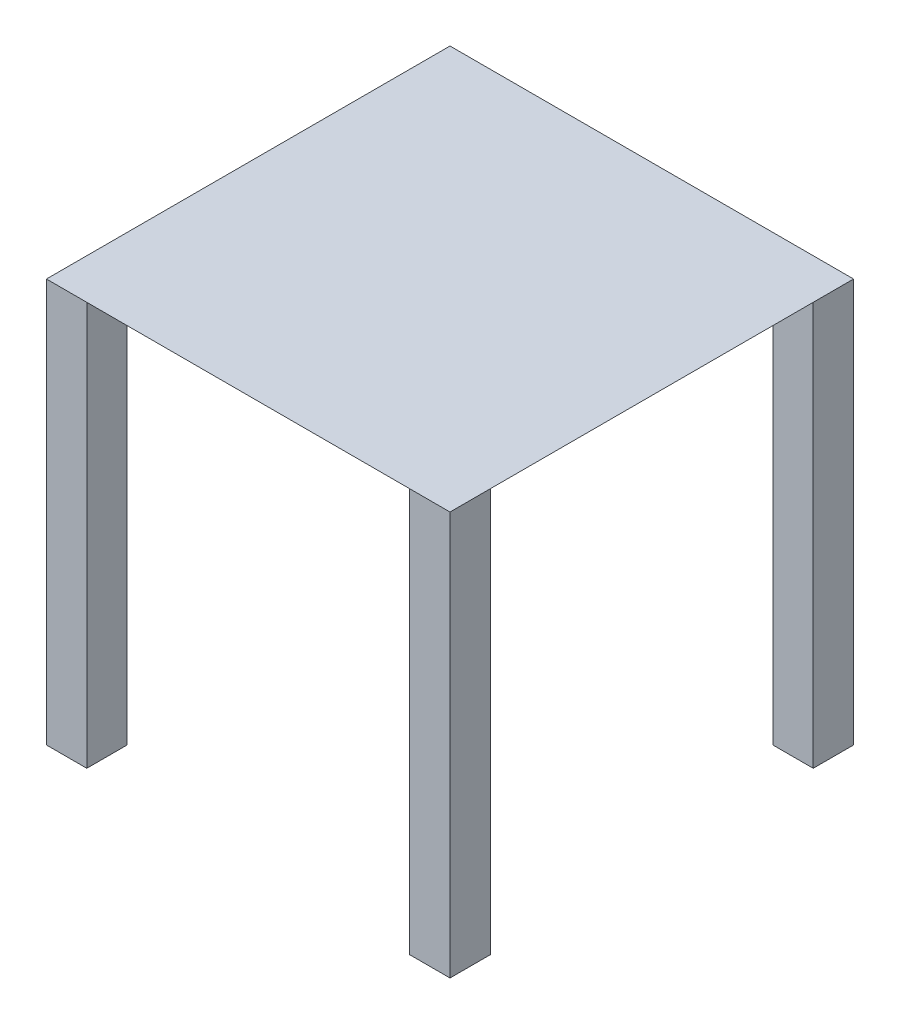
ISO-10303-21;
HEADER;
FILE_DESCRIPTION(('STEP AP214'),'2;1');
FILE_NAME('part.step','',(''),(''),'','','');
FILE_SCHEMA(('AUTOMOTIVE_DESIGN { 1 0 10303 214 1 1 1 1 }'));
ENDSEC;
DATA;
#1=APPLICATION_CONTEXT('core data for automotive mechanical design processes');
#2=APPLICATION_PROTOCOL_DEFINITION('international standard','automotive_design',2000,#1);
#3=PRODUCT_CONTEXT('',#1,'mechanical');
#4=PRODUCT('Part','Part','',(#3));
#5=PRODUCT_RELATED_PRODUCT_CATEGORY('part','',(#4));
#6=PRODUCT_DEFINITION_FORMATION('','',#4);
#7=PRODUCT_DEFINITION_CONTEXT('part definition',#1,'design');
#8=PRODUCT_DEFINITION('design','',#6,#7);
#9=PRODUCT_DEFINITION_SHAPE('','',#8);
#10=(LENGTH_UNIT() NAMED_UNIT(*) SI_UNIT(.MILLI.,.METRE.));
#11=(NAMED_UNIT(*) PLANE_ANGLE_UNIT() SI_UNIT($,.RADIAN.));
#12=(NAMED_UNIT(*) SI_UNIT($,.STERADIAN.) SOLID_ANGLE_UNIT());
#13=UNCERTAINTY_MEASURE_WITH_UNIT(LENGTH_MEASURE(1.E-05),#10,'distance_accuracy_value','');
#14=(GEOMETRIC_REPRESENTATION_CONTEXT(3) GLOBAL_UNCERTAINTY_ASSIGNED_CONTEXT((#13)) GLOBAL_UNIT_ASSIGNED_CONTEXT((#10,
#11,#12)) REPRESENTATION_CONTEXT('',''));
#15=CARTESIAN_POINT('',(0.,0.,0.));
#16=DIRECTION('',(0.,0.,1.));
#17=DIRECTION('',(1.,0.,0.));
#18=AXIS2_PLACEMENT_3D('',#15,#16,#17);
#19=CARTESIAN_POINT('',(0.,0.,0.));
#20=DIRECTION('',(0.,-1.,0.));
#21=DIRECTION('',(0.,0.,-1.));
#22=AXIS2_PLACEMENT_3D('',#19,#20,#21);
#23=PLANE('',#22);
#24=DIRECTION('',(1.,0.,0.));
#25=VECTOR('',#24,1.);
#26=CARTESIAN_POINT('',(-500.,0.,500.));
#27=LINE('',#26,#25);
#28=CARTESIAN_POINT('',(-400.,0.,500.));
#29=VERTEX_POINT('',#28);
#30=CARTESIAN_POINT('',(400.,0.,500.));
#31=VERTEX_POINT('',#30);
#32=EDGE_CURVE('E45',#29,#31,#27,.T.);
#33=ORIENTED_EDGE('',*,*,#32,.T.);
#34=DIRECTION('',(1.,0.,0.));
#35=VECTOR('',#34,1.);
#36=CARTESIAN_POINT('',(500.,0.,500.));
#37=LINE('',#36,#35);
#38=CARTESIAN_POINT('',(500.,0.,500.));
#39=VERTEX_POINT('',#38);
#40=EDGE_CURVE('E202',#31,#39,#37,.T.);
#41=ORIENTED_EDGE('',*,*,#40,.T.);
#42=DIRECTION('',(0.,0.,-1.));
#43=VECTOR('',#42,1.);
#44=CARTESIAN_POINT('',(500.,0.,500.));
#45=LINE('',#44,#43);
#46=CARTESIAN_POINT('',(500.,0.,400.));
#47=VERTEX_POINT('',#46);
#48=EDGE_CURVE('E226',#39,#47,#45,.T.);
#49=ORIENTED_EDGE('',*,*,#48,.T.);
#50=CARTESIAN_POINT('',(500.,0.,-400.));
#51=VERTEX_POINT('',#50);
#52=EDGE_CURVE('E231',#47,#51,#45,.T.);
#53=ORIENTED_EDGE('',*,*,#52,.T.);
#54=DIRECTION('',(0.,0.,-1.));
#55=VECTOR('',#54,1.);
#56=CARTESIAN_POINT('',(500.,0.,-500.));
#57=LINE('',#56,#55);
#58=CARTESIAN_POINT('',(500.,0.,-500.));
#59=VERTEX_POINT('',#58);
#60=EDGE_CURVE('E350',#51,#59,#57,.T.);
#61=ORIENTED_EDGE('',*,*,#60,.T.);
#62=DIRECTION('',(-1.,0.,0.));
#63=VECTOR('',#62,1.);
#64=CARTESIAN_POINT('',(-500.,0.,-500.));
#65=LINE('',#64,#63);
#66=CARTESIAN_POINT('',(400.,0.,-500.));
#67=VERTEX_POINT('',#66);
#68=EDGE_CURVE('E466',#59,#67,#65,.T.);
#69=ORIENTED_EDGE('',*,*,#68,.T.);
#70=CARTESIAN_POINT('',(-400.,0.,-500.));
#71=VERTEX_POINT('',#70);
#72=EDGE_CURVE('E230',#67,#71,#65,.T.);
#73=ORIENTED_EDGE('',*,*,#72,.T.);
#74=DIRECTION('',(-1.,0.,0.));
#75=VECTOR('',#74,1.);
#76=CARTESIAN_POINT('',(-500.,0.,-500.));
#77=LINE('',#76,#75);
#78=CARTESIAN_POINT('',(-500.,0.,-500.));
#79=VERTEX_POINT('',#78);
#80=EDGE_CURVE('E378',#71,#79,#77,.T.);
#81=ORIENTED_EDGE('',*,*,#80,.T.);
#82=DIRECTION('',(0.,0.,1.));
#83=VECTOR('',#82,1.);
#84=CARTESIAN_POINT('',(-500.,0.,500.));
#85=LINE('',#84,#83);
#86=CARTESIAN_POINT('',(-500.,0.,-400.));
#87=VERTEX_POINT('',#86);
#88=EDGE_CURVE('E455',#79,#87,#85,.T.);
#89=ORIENTED_EDGE('',*,*,#88,.T.);
#90=CARTESIAN_POINT('',(-500.,0.,400.));
#91=VERTEX_POINT('',#90);
#92=EDGE_CURVE('E458',#87,#91,#85,.T.);
#93=ORIENTED_EDGE('',*,*,#92,.T.);
#94=DIRECTION('',(0.,0.,1.));
#95=VECTOR('',#94,1.);
#96=CARTESIAN_POINT('',(-500.,0.,500.));
#97=LINE('',#96,#95);
#98=CARTESIAN_POINT('',(-500.,0.,500.));
#99=VERTEX_POINT('',#98);
#100=EDGE_CURVE('E220',#91,#99,#97,.T.);
#101=ORIENTED_EDGE('',*,*,#100,.T.);
#102=EDGE_CURVE('E471',#99,#29,#27,.T.);
#103=ORIENTED_EDGE('',*,*,#102,.T.);
#104=EDGE_LOOP('',(#33,#41,#49,#53,#61,#69,#73,#81,#89,#93,#101,#103));
#105=FACE_BOUND('',#104,.T.);
#106=ADVANCED_FACE('F40',(#105),#23,.F.);
#107=CARTESIAN_POINT('',(-195.121951219512,-243.90243902439,0.));
#108=DIRECTION('',(0.624695047554424,0.78086880944303,0.));
#109=DIRECTION('',(-0.78086880944303,0.624695047554424,0.));
#110=AXIS2_PLACEMENT_3D('',#107,#108,#109);
#111=PLANE('',#110);
#112=DIRECTION('',(0.615457454896664,-0.492365963917331,-0.615457454896664));
#113=VECTOR('',#112,1.);
#114=CARTESIAN_POINT('',(-500.,0.,500.));
#115=LINE('',#114,#113);
#116=CARTESIAN_POINT('',(-400.,-80.,400.));
#117=VERTEX_POINT('',#116);
#118=CARTESIAN_POINT('',(-75.0000000000011,-339.999999999999,75.0000000000015));
#119=VERTEX_POINT('',#118);
#120=EDGE_CURVE('E454',#117,#119,#115,.T.);
#121=ORIENTED_EDGE('',*,*,#120,.F.);
#122=DIRECTION('',(-0.78086880944303,0.624695047554424,0.));
#123=VECTOR('',#122,1.);
#124=CARTESIAN_POINT('',(-195.121951219512,-243.90243902439,400.));
#125=LINE('',#124,#123);
#126=EDGE_CURVE('E346',#117,#91,#125,.T.);
#127=ORIENTED_EDGE('',*,*,#126,.T.);
#128=ORIENTED_EDGE('',*,*,#92,.F.);
#129=DIRECTION('',(0.78086880944303,-0.624695047554424,0.));
#130=VECTOR('',#129,1.);
#131=CARTESIAN_POINT('',(-195.121951219512,-243.90243902439,-400.));
#132=LINE('',#131,#130);
#133=CARTESIAN_POINT('',(-400.,-80.,-400.));
#134=VERTEX_POINT('',#133);
#135=EDGE_CURVE('E396',#87,#134,#132,.T.);
#136=ORIENTED_EDGE('',*,*,#135,.T.);
#137=DIRECTION('',(0.615457454896664,-0.492365963917331,0.615457454896664));
#138=VECTOR('',#137,1.);
#139=CARTESIAN_POINT('',(-500.,0.,-500.));
#140=LINE('',#139,#138);
#141=CARTESIAN_POINT('',(-75.0000000000011,-340.000000000001,-74.9999999999985));
#142=VERTEX_POINT('',#141);
#143=EDGE_CURVE('E472',#134,#142,#140,.T.);
#144=ORIENTED_EDGE('',*,*,#143,.T.);
#145=DIRECTION('',(0.,0.,1.));
#146=VECTOR('',#145,1.);
#147=CARTESIAN_POINT('',(-75.0000000000011,-339.999999999999,0.));
#148=LINE('',#147,#146);
#149=EDGE_CURVE('E316',#142,#119,#148,.T.);
#150=ORIENTED_EDGE('',*,*,#149,.T.);
#151=EDGE_LOOP('',(#121,#127,#128,#136,#144,#150));
#152=FACE_BOUND('',#151,.T.);
#153=ADVANCED_FACE('F255',(#152),#111,.F.);
#154=CARTESIAN_POINT('',(0.,-243.90243902439,195.121951219512));
#155=DIRECTION('',(0.,0.78086880944303,-0.624695047554424));
#156=DIRECTION('',(0.,0.624695047554424,0.78086880944303));
#157=AXIS2_PLACEMENT_3D('',#154,#155,#156);
#158=PLANE('',#157);
#159=DIRECTION('',(-0.615457454896663,-0.492365963917331,-0.615457454896664));
#160=VECTOR('',#159,1.);
#161=CARTESIAN_POINT('',(500.,0.,500.));
#162=LINE('',#161,#160);
#163=CARTESIAN_POINT('',(400.,-80.,400.));
#164=VERTEX_POINT('',#163);
#165=CARTESIAN_POINT('',(74.9999999999989,-340.000000000001,75.0000000000015));
#166=VERTEX_POINT('',#165);
#167=EDGE_CURVE('E453',#164,#166,#162,.T.);
#168=ORIENTED_EDGE('',*,*,#167,.F.);
#169=DIRECTION('',(0.,0.624695047554424,0.78086880944303));
#170=VECTOR('',#169,1.);
#171=CARTESIAN_POINT('',(400.,-243.90243902439,195.121951219512));
#172=LINE('',#171,#170);
#173=EDGE_CURVE('E216',#164,#31,#172,.T.);
#174=ORIENTED_EDGE('',*,*,#173,.T.);
#175=ORIENTED_EDGE('',*,*,#32,.F.);
#176=DIRECTION('',(0.,-0.624695047554424,-0.78086880944303));
#177=VECTOR('',#176,1.);
#178=CARTESIAN_POINT('',(-400.,-243.90243902439,195.121951219512));
#179=LINE('',#178,#177);
#180=EDGE_CURVE('E51',#29,#117,#179,.T.);
#181=ORIENTED_EDGE('',*,*,#180,.T.);
#182=ORIENTED_EDGE('',*,*,#120,.T.);
#183=DIRECTION('',(1.,0.,0.));
#184=VECTOR('',#183,1.);
#185=CARTESIAN_POINT('',(0.,-339.999999999999,75.0000000000015));
#186=LINE('',#185,#184);
#187=EDGE_CURVE('E419',#119,#166,#186,.T.);
#188=ORIENTED_EDGE('',*,*,#187,.T.);
#189=EDGE_LOOP('',(#168,#174,#175,#181,#182,#188));
#190=FACE_BOUND('',#189,.T.);
#191=ADVANCED_FACE('F307',(#190),#158,.F.);
#192=CARTESIAN_POINT('',(0.,-243.90243902439,-195.121951219512));
#193=DIRECTION('',(0.,0.78086880944303,0.624695047554424));
#194=DIRECTION('',(0.,-0.624695047554424,0.78086880944303));
#195=AXIS2_PLACEMENT_3D('',#192,#193,#194);
#196=PLANE('',#195);
#197=ORIENTED_EDGE('',*,*,#72,.F.);
#198=DIRECTION('',(0.,-0.624695047554424,0.78086880944303));
#199=VECTOR('',#198,1.);
#200=CARTESIAN_POINT('',(400.,-243.90243902439,-195.121951219512));
#201=LINE('',#200,#199);
#202=CARTESIAN_POINT('',(400.,-80.,-400.));
#203=VERTEX_POINT('',#202);
#204=EDGE_CURVE('E440',#67,#203,#201,.T.);
#205=ORIENTED_EDGE('',*,*,#204,.T.);
#206=DIRECTION('',(-0.615457454896664,-0.492365963917331,0.615457454896664));
#207=VECTOR('',#206,1.);
#208=CARTESIAN_POINT('',(500.,0.,-500.));
#209=LINE('',#208,#207);
#210=CARTESIAN_POINT('',(74.9999999999984,-340.000000000001,-74.9999999999985));
#211=VERTEX_POINT('',#210);
#212=EDGE_CURVE('E447',#203,#211,#209,.T.);
#213=ORIENTED_EDGE('',*,*,#212,.T.);
#214=DIRECTION('',(-1.,0.,0.));
#215=VECTOR('',#214,1.);
#216=CARTESIAN_POINT('',(0.,-340.000000000001,-74.9999999999985));
#217=LINE('',#216,#215);
#218=EDGE_CURVE('E409',#211,#142,#217,.T.);
#219=ORIENTED_EDGE('',*,*,#218,.T.);
#220=ORIENTED_EDGE('',*,*,#143,.F.);
#221=DIRECTION('',(0.,0.624695047554424,-0.78086880944303));
#222=VECTOR('',#221,1.);
#223=CARTESIAN_POINT('',(-400.,-243.90243902439,-195.121951219512));
#224=LINE('',#223,#222);
#225=EDGE_CURVE('E448',#134,#71,#224,.T.);
#226=ORIENTED_EDGE('',*,*,#225,.T.);
#227=EDGE_LOOP('',(#197,#205,#213,#219,#220,#226));
#228=FACE_BOUND('',#227,.T.);
#229=ADVANCED_FACE('F299',(#228),#196,.F.);
#230=CARTESIAN_POINT('',(195.121951219512,-243.90243902439,0.));
#231=DIRECTION('',(-0.624695047554424,0.78086880944303,0.));
#232=DIRECTION('',(-0.78086880944303,-0.624695047554424,0.));
#233=AXIS2_PLACEMENT_3D('',#230,#231,#232);
#234=PLANE('',#233);
#235=ORIENTED_EDGE('',*,*,#52,.F.);
#236=DIRECTION('',(-0.78086880944303,-0.624695047554424,0.));
#237=VECTOR('',#236,1.);
#238=CARTESIAN_POINT('',(195.121951219512,-243.90243902439,400.));
#239=LINE('',#238,#237);
#240=EDGE_CURVE('E12',#47,#164,#239,.T.);
#241=ORIENTED_EDGE('',*,*,#240,.T.);
#242=ORIENTED_EDGE('',*,*,#167,.T.);
#243=DIRECTION('',(0.,0.,-1.));
#244=VECTOR('',#243,1.);
#245=CARTESIAN_POINT('',(74.9999999999989,-340.000000000001,0.));
#246=LINE('',#245,#244);
#247=EDGE_CURVE('E449',#166,#211,#246,.T.);
#248=ORIENTED_EDGE('',*,*,#247,.T.);
#249=ORIENTED_EDGE('',*,*,#212,.F.);
#250=DIRECTION('',(0.78086880944303,0.624695047554424,0.));
#251=VECTOR('',#250,1.);
#252=CARTESIAN_POINT('',(195.121951219512,-243.90243902439,-400.));
#253=LINE('',#252,#251);
#254=EDGE_CURVE('E334',#203,#51,#253,.T.);
#255=ORIENTED_EDGE('',*,*,#254,.T.);
#256=EDGE_LOOP('',(#235,#241,#242,#248,#249,#255));
#257=FACE_BOUND('',#256,.T.);
#258=ADVANCED_FACE('F42',(#257),#234,.F.);
#259=CARTESIAN_POINT('',(-75.0000000000008,-299.999999999999,75.0000000000015));
#260=DIRECTION('',(-1.,0.,0.));
#261=DIRECTION('',(0.,-1.,0.));
#262=AXIS2_PLACEMENT_3D('',#259,#260,#261);
#263=PLANE('',#262);
#264=DIRECTION('',(0.,-1.,0.));
#265=VECTOR('',#264,1.);
#266=CARTESIAN_POINT('',(-75.0000000000008,-299.999999999999,-74.9999999999985));
#267=LINE('',#266,#265);
#268=CARTESIAN_POINT('',(-75.0000000000008,-299.999999999999,-74.9999999999985));
#269=VERTEX_POINT('',#268);
#270=EDGE_CURVE('E405',#269,#142,#267,.T.);
#271=ORIENTED_EDGE('',*,*,#270,.F.);
#272=DIRECTION('',(0.,0.,-1.));
#273=VECTOR('',#272,1.);
#274=CARTESIAN_POINT('',(-75.0000000000008,-299.999999999999,75.0000000000015));
#275=LINE('',#274,#273);
#276=CARTESIAN_POINT('',(-75.0000000000008,-299.999999999999,75.0000000000015));
#277=VERTEX_POINT('',#276);
#278=EDGE_CURVE('E392',#277,#269,#275,.T.);
#279=ORIENTED_EDGE('',*,*,#278,.F.);
#280=DIRECTION('',(0.,-1.,0.));
#281=VECTOR('',#280,1.);
#282=CARTESIAN_POINT('',(-75.0000000000008,-299.999999999999,75.0000000000015));
#283=LINE('',#282,#281);
#284=EDGE_CURVE('E406',#277,#119,#283,.T.);
#285=ORIENTED_EDGE('',*,*,#284,.T.);
#286=ORIENTED_EDGE('',*,*,#149,.F.);
#287=EDGE_LOOP('',(#271,#279,#285,#286));
#288=FACE_BOUND('',#287,.T.);
#289=ADVANCED_FACE('F257',(#288),#263,.F.);
#290=CARTESIAN_POINT('',(74.9999999999992,-300.000000000001,75.0000000000015));
#291=DIRECTION('',(0.,0.,1.));
#292=DIRECTION('',(1.,0.,0.));
#293=AXIS2_PLACEMENT_3D('',#290,#291,#292);
#294=PLANE('',#293);
#295=ORIENTED_EDGE('',*,*,#284,.F.);
#296=DIRECTION('',(-1.,0.,0.));
#297=VECTOR('',#296,1.);
#298=CARTESIAN_POINT('',(74.9999999999992,-300.000000000001,75.0000000000015));
#299=LINE('',#298,#297);
#300=CARTESIAN_POINT('',(74.9999999999992,-300.000000000001,75.0000000000015));
#301=VERTEX_POINT('',#300);
#302=EDGE_CURVE('E402',#301,#277,#299,.T.);
#303=ORIENTED_EDGE('',*,*,#302,.F.);
#304=DIRECTION('',(0.,-1.,0.));
#305=VECTOR('',#304,1.);
#306=CARTESIAN_POINT('',(74.9999999999992,-300.000000000001,75.0000000000015));
#307=LINE('',#306,#305);
#308=EDGE_CURVE('E410',#301,#166,#307,.T.);
#309=ORIENTED_EDGE('',*,*,#308,.T.);
#310=ORIENTED_EDGE('',*,*,#187,.F.);
#311=EDGE_LOOP('',(#295,#303,#309,#310));
#312=FACE_BOUND('',#311,.T.);
#313=ADVANCED_FACE('F488',(#312),#294,.F.);
#314=CARTESIAN_POINT('',(74.9999999999992,-300.000000000001,75.0000000000015));
#315=DIRECTION('',(1.,0.,0.));
#316=DIRECTION('',(0.,1.,0.));
#317=AXIS2_PLACEMENT_3D('',#314,#315,#316);
#318=PLANE('',#317);
#319=ORIENTED_EDGE('',*,*,#308,.F.);
#320=DIRECTION('',(0.,0.,1.));
#321=VECTOR('',#320,1.);
#322=CARTESIAN_POINT('',(74.9999999999992,-300.000000000001,75.0000000000015));
#323=LINE('',#322,#321);
#324=CARTESIAN_POINT('',(74.9999999999992,-300.000000000001,-74.9999999999985));
#325=VERTEX_POINT('',#324);
#326=EDGE_CURVE('E399',#325,#301,#323,.T.);
#327=ORIENTED_EDGE('',*,*,#326,.F.);
#328=DIRECTION('',(0.,-1.,0.));
#329=VECTOR('',#328,1.);
#330=CARTESIAN_POINT('',(74.9999999999992,-300.000000000001,-74.9999999999985));
#331=LINE('',#330,#329);
#332=EDGE_CURVE('E413',#325,#211,#331,.T.);
#333=ORIENTED_EDGE('',*,*,#332,.T.);
#334=ORIENTED_EDGE('',*,*,#247,.F.);
#335=EDGE_LOOP('',(#319,#327,#333,#334));
#336=FACE_BOUND('',#335,.T.);
#337=ADVANCED_FACE('F483',(#336),#318,.F.);
#338=CARTESIAN_POINT('',(74.9999999999992,-300.000000000001,-74.9999999999985));
#339=DIRECTION('',(0.,0.,-1.));
#340=DIRECTION('',(-1.,0.,0.));
#341=AXIS2_PLACEMENT_3D('',#338,#339,#340);
#342=PLANE('',#341);
#343=ORIENTED_EDGE('',*,*,#332,.F.);
#344=DIRECTION('',(1.,0.,0.));
#345=VECTOR('',#344,1.);
#346=CARTESIAN_POINT('',(74.9999999999992,-300.000000000001,-74.9999999999985));
#347=LINE('',#346,#345);
#348=EDGE_CURVE('E395',#269,#325,#347,.T.);
#349=ORIENTED_EDGE('',*,*,#348,.F.);
#350=ORIENTED_EDGE('',*,*,#270,.T.);
#351=ORIENTED_EDGE('',*,*,#218,.F.);
#352=EDGE_LOOP('',(#343,#349,#350,#351));
#353=FACE_BOUND('',#352,.T.);
#354=ADVANCED_FACE('F494',(#353),#342,.F.);
#355=CARTESIAN_POINT('',(-1.96623899133175E-12,-300.,0.));
#356=DIRECTION('',(0.,1.,0.));
#357=DIRECTION('',(-1.,0.,0.));
#358=AXIS2_PLACEMENT_3D('',#355,#356,#357);
#359=PLANE('',#358);
#360=ORIENTED_EDGE('',*,*,#278,.T.);
#361=ORIENTED_EDGE('',*,*,#348,.T.);
#362=ORIENTED_EDGE('',*,*,#326,.T.);
#363=ORIENTED_EDGE('',*,*,#302,.T.);
#364=EDGE_LOOP('',(#360,#361,#362,#363));
#365=FACE_BOUND('',#364,.T.);
#366=ADVANCED_FACE('F491',(#365),#359,.F.);
#367=CARTESIAN_POINT('',(-400.,-1000.,-500.));
#368=DIRECTION('',(1.,0.,0.));
#369=DIRECTION('',(0.,0.,-1.));
#370=AXIS2_PLACEMENT_3D('',#367,#368,#369);
#371=PLANE('',#370);
#372=ORIENTED_EDGE('',*,*,#225,.F.);
#373=DIRECTION('',(0.,1.,0.));
#374=VECTOR('',#373,1.);
#375=CARTESIAN_POINT('',(-400.,-1000.,-400.));
#376=LINE('',#375,#374);
#377=CARTESIAN_POINT('',(-400.,-1000.,-400.));
#378=VERTEX_POINT('',#377);
#379=EDGE_CURVE('E388',#378,#134,#376,.T.);
#380=ORIENTED_EDGE('',*,*,#379,.F.);
#381=DIRECTION('',(0.,0.,-1.));
#382=VECTOR('',#381,1.);
#383=CARTESIAN_POINT('',(-400.,-1000.,-500.));
#384=LINE('',#383,#382);
#385=CARTESIAN_POINT('',(-400.,-1000.,-500.));
#386=VERTEX_POINT('',#385);
#387=EDGE_CURVE('E381',#378,#386,#384,.T.);
#388=ORIENTED_EDGE('',*,*,#387,.T.);
#389=DIRECTION('',(0.,1.,0.));
#390=VECTOR('',#389,1.);
#391=CARTESIAN_POINT('',(-400.,-1000.,-500.));
#392=LINE('',#391,#390);
#393=EDGE_CURVE('E391',#386,#71,#392,.T.);
#394=ORIENTED_EDGE('',*,*,#393,.T.);
#395=EDGE_LOOP('',(#372,#380,#388,#394));
#396=FACE_BOUND('',#395,.T.);
#397=ADVANCED_FACE('F563',(#396),#371,.T.);
#398=CARTESIAN_POINT('',(-500.,-1000.,-400.));
#399=DIRECTION('',(0.,0.,1.));
#400=DIRECTION('',(1.,0.,0.));
#401=AXIS2_PLACEMENT_3D('',#398,#399,#400);
#402=PLANE('',#401);
#403=ORIENTED_EDGE('',*,*,#135,.F.);
#404=DIRECTION('',(0.,1.,0.));
#405=VECTOR('',#404,1.);
#406=CARTESIAN_POINT('',(-500.,-1000.,-400.));
#407=LINE('',#406,#405);
#408=CARTESIAN_POINT('',(-500.,-1000.,-400.));
#409=VERTEX_POINT('',#408);
#410=EDGE_CURVE('E387',#409,#87,#407,.T.);
#411=ORIENTED_EDGE('',*,*,#410,.F.);
#412=DIRECTION('',(1.,0.,0.));
#413=VECTOR('',#412,1.);
#414=CARTESIAN_POINT('',(-500.,-1000.,-400.));
#415=LINE('',#414,#413);
#416=EDGE_CURVE('E377',#409,#378,#415,.T.);
#417=ORIENTED_EDGE('',*,*,#416,.T.);
#418=ORIENTED_EDGE('',*,*,#379,.T.);
#419=EDGE_LOOP('',(#403,#411,#417,#418));
#420=FACE_BOUND('',#419,.T.);
#421=ADVANCED_FACE('F557',(#420),#402,.T.);
#422=CARTESIAN_POINT('',(-500.,-1000.,-500.));
#423=DIRECTION('',(-1.,0.,0.));
#424=DIRECTION('',(0.,0.,1.));
#425=AXIS2_PLACEMENT_3D('',#422,#423,#424);
#426=PLANE('',#425);
#427=ORIENTED_EDGE('',*,*,#88,.F.);
#428=DIRECTION('',(0.,1.,0.));
#429=VECTOR('',#428,1.);
#430=CARTESIAN_POINT('',(-500.,-1000.,-500.));
#431=LINE('',#430,#429);
#432=CARTESIAN_POINT('',(-500.,-1000.,-500.));
#433=VERTEX_POINT('',#432);
#434=EDGE_CURVE('E519',#433,#79,#431,.T.);
#435=ORIENTED_EDGE('',*,*,#434,.F.);
#436=DIRECTION('',(0.,0.,1.));
#437=VECTOR('',#436,1.);
#438=CARTESIAN_POINT('',(-500.,-1000.,-500.));
#439=LINE('',#438,#437);
#440=EDGE_CURVE('E374',#433,#409,#439,.T.);
#441=ORIENTED_EDGE('',*,*,#440,.T.);
#442=ORIENTED_EDGE('',*,*,#410,.T.);
#443=EDGE_LOOP('',(#427,#435,#441,#442));
#444=FACE_BOUND('',#443,.T.);
#445=ADVANCED_FACE('F553',(#444),#426,.T.);
#446=CARTESIAN_POINT('',(-500.,-1000.,-500.));
#447=DIRECTION('',(0.,0.,-1.));
#448=DIRECTION('',(-1.,0.,0.));
#449=AXIS2_PLACEMENT_3D('',#446,#447,#448);
#450=PLANE('',#449);
#451=ORIENTED_EDGE('',*,*,#80,.F.);
#452=ORIENTED_EDGE('',*,*,#393,.F.);
#453=DIRECTION('',(-1.,0.,0.));
#454=VECTOR('',#453,1.);
#455=CARTESIAN_POINT('',(-500.,-1000.,-500.));
#456=LINE('',#455,#454);
#457=EDGE_CURVE('E384',#386,#433,#456,.T.);
#458=ORIENTED_EDGE('',*,*,#457,.T.);
#459=ORIENTED_EDGE('',*,*,#434,.T.);
#460=EDGE_LOOP('',(#451,#452,#458,#459));
#461=FACE_BOUND('',#460,.T.);
#462=ADVANCED_FACE('F642',(#461),#450,.T.);
#463=CARTESIAN_POINT('',(0.,-1000.,0.));
#464=DIRECTION('',(0.,1.,0.));
#465=DIRECTION('',(0.,0.,1.));
#466=AXIS2_PLACEMENT_3D('',#463,#464,#465);
#467=PLANE('',#466);
#468=ORIENTED_EDGE('',*,*,#440,.F.);
#469=ORIENTED_EDGE('',*,*,#457,.F.);
#470=ORIENTED_EDGE('',*,*,#387,.F.);
#471=ORIENTED_EDGE('',*,*,#416,.F.);
#472=EDGE_LOOP('',(#468,#469,#470,#471));
#473=FACE_BOUND('',#472,.T.);
#474=ADVANCED_FACE('F560',(#473),#467,.F.);
#475=CARTESIAN_POINT('',(500.,-1000.,-400.));
#476=DIRECTION('',(0.,0.,1.));
#477=DIRECTION('',(1.,0.,0.));
#478=AXIS2_PLACEMENT_3D('',#475,#476,#477);
#479=PLANE('',#478);
#480=ORIENTED_EDGE('',*,*,#254,.F.);
#481=DIRECTION('',(0.,1.,0.));
#482=VECTOR('',#481,1.);
#483=CARTESIAN_POINT('',(400.,-1000.,-400.));
#484=LINE('',#483,#482);
#485=CARTESIAN_POINT('',(400.,-1000.,-400.));
#486=VERTEX_POINT('',#485);
#487=EDGE_CURVE('E369',#486,#203,#484,.T.);
#488=ORIENTED_EDGE('',*,*,#487,.F.);
#489=DIRECTION('',(1.,0.,0.));
#490=VECTOR('',#489,1.);
#491=CARTESIAN_POINT('',(500.,-1000.,-400.));
#492=LINE('',#491,#490);
#493=CARTESIAN_POINT('',(500.,-1000.,-400.));
#494=VERTEX_POINT('',#493);
#495=EDGE_CURVE('E366',#486,#494,#492,.T.);
#496=ORIENTED_EDGE('',*,*,#495,.T.);
#497=DIRECTION('',(0.,1.,0.));
#498=VECTOR('',#497,1.);
#499=CARTESIAN_POINT('',(500.,-1000.,-400.));
#500=LINE('',#499,#498);
#501=EDGE_CURVE('E372',#494,#51,#500,.T.);
#502=ORIENTED_EDGE('',*,*,#501,.T.);
#503=EDGE_LOOP('',(#480,#488,#496,#502));
#504=FACE_BOUND('',#503,.T.);
#505=ADVANCED_FACE('F436',(#504),#479,.T.);
#506=CARTESIAN_POINT('',(400.,-1000.,-500.));
#507=DIRECTION('',(-1.,0.,0.));
#508=DIRECTION('',(0.,0.,1.));
#509=AXIS2_PLACEMENT_3D('',#506,#507,#508);
#510=PLANE('',#509);
#511=ORIENTED_EDGE('',*,*,#204,.F.);
#512=DIRECTION('',(0.,1.,0.));
#513=VECTOR('',#512,1.);
#514=CARTESIAN_POINT('',(400.,-1000.,-500.));
#515=LINE('',#514,#513);
#516=CARTESIAN_POINT('',(400.,-1000.,-500.));
#517=VERTEX_POINT('',#516);
#518=EDGE_CURVE('E373',#517,#67,#515,.T.);
#519=ORIENTED_EDGE('',*,*,#518,.F.);
#520=DIRECTION('',(0.,0.,1.));
#521=VECTOR('',#520,1.);
#522=CARTESIAN_POINT('',(400.,-1000.,-500.));
#523=LINE('',#522,#521);
#524=EDGE_CURVE('E363',#517,#486,#523,.T.);
#525=ORIENTED_EDGE('',*,*,#524,.T.);
#526=ORIENTED_EDGE('',*,*,#487,.T.);
#527=EDGE_LOOP('',(#511,#519,#525,#526));
#528=FACE_BOUND('',#527,.T.);
#529=ADVANCED_FACE('F654',(#528),#510,.T.);
#530=CARTESIAN_POINT('',(500.,-1000.,-500.));
#531=DIRECTION('',(1.,0.,0.));
#532=DIRECTION('',(0.,0.,-1.));
#533=AXIS2_PLACEMENT_3D('',#530,#531,#532);
#534=PLANE('',#533);
#535=ORIENTED_EDGE('',*,*,#60,.F.);
#536=ORIENTED_EDGE('',*,*,#501,.F.);
#537=DIRECTION('',(0.,0.,-1.));
#538=VECTOR('',#537,1.);
#539=CARTESIAN_POINT('',(500.,-1000.,-500.));
#540=LINE('',#539,#538);
#541=CARTESIAN_POINT('',(500.,-1000.,-500.));
#542=VERTEX_POINT('',#541);
#543=EDGE_CURVE('E357',#494,#542,#540,.T.);
#544=ORIENTED_EDGE('',*,*,#543,.T.);
#545=DIRECTION('',(0.,1.,0.));
#546=VECTOR('',#545,1.);
#547=CARTESIAN_POINT('',(500.,-1000.,-500.));
#548=LINE('',#547,#546);
#549=EDGE_CURVE('E289',#542,#59,#548,.T.);
#550=ORIENTED_EDGE('',*,*,#549,.T.);
#551=EDGE_LOOP('',(#535,#536,#544,#550));
#552=FACE_BOUND('',#551,.T.);
#553=ADVANCED_FACE('F443',(#552),#534,.T.);
#554=CARTESIAN_POINT('',(500.,-1000.,-500.));
#555=DIRECTION('',(0.,0.,-1.));
#556=DIRECTION('',(-1.,0.,0.));
#557=AXIS2_PLACEMENT_3D('',#554,#555,#556);
#558=PLANE('',#557);
#559=ORIENTED_EDGE('',*,*,#68,.F.);
#560=ORIENTED_EDGE('',*,*,#549,.F.);
#561=DIRECTION('',(-1.,0.,0.));
#562=VECTOR('',#561,1.);
#563=CARTESIAN_POINT('',(500.,-1000.,-500.));
#564=LINE('',#563,#562);
#565=EDGE_CURVE('E360',#542,#517,#564,.T.);
#566=ORIENTED_EDGE('',*,*,#565,.T.);
#567=ORIENTED_EDGE('',*,*,#518,.T.);
#568=EDGE_LOOP('',(#559,#560,#566,#567));
#569=FACE_BOUND('',#568,.T.);
#570=ADVANCED_FACE('F653',(#569),#558,.T.);
#571=CARTESIAN_POINT('',(0.,-1000.,0.));
#572=DIRECTION('',(0.,-1.,0.));
#573=DIRECTION('',(0.,0.,-1.));
#574=AXIS2_PLACEMENT_3D('',#571,#572,#573);
#575=PLANE('',#574);
#576=ORIENTED_EDGE('',*,*,#543,.F.);
#577=ORIENTED_EDGE('',*,*,#495,.F.);
#578=ORIENTED_EDGE('',*,*,#524,.F.);
#579=ORIENTED_EDGE('',*,*,#565,.F.);
#580=EDGE_LOOP('',(#576,#577,#578,#579));
#581=FACE_BOUND('',#580,.T.);
#582=ADVANCED_FACE('F657',(#581),#575,.T.);
#583=CARTESIAN_POINT('',(-500.,-1000.,400.));
#584=DIRECTION('',(0.,0.,-1.));
#585=DIRECTION('',(-1.,0.,0.));
#586=AXIS2_PLACEMENT_3D('',#583,#584,#585);
#587=PLANE('',#586);
#588=ORIENTED_EDGE('',*,*,#126,.F.);
#589=DIRECTION('',(0.,1.,0.));
#590=VECTOR('',#589,1.);
#591=CARTESIAN_POINT('',(-400.,-1000.,400.));
#592=LINE('',#591,#590);
#593=CARTESIAN_POINT('',(-400.,-1000.,400.));
#594=VERTEX_POINT('',#593);
#595=EDGE_CURVE('E338',#594,#117,#592,.T.);
#596=ORIENTED_EDGE('',*,*,#595,.F.);
#597=DIRECTION('',(-1.,0.,0.));
#598=VECTOR('',#597,1.);
#599=CARTESIAN_POINT('',(-500.,-1000.,400.));
#600=LINE('',#599,#598);
#601=CARTESIAN_POINT('',(-500.,-1000.,400.));
#602=VERTEX_POINT('',#601);
#603=EDGE_CURVE('E343',#594,#602,#600,.T.);
#604=ORIENTED_EDGE('',*,*,#603,.T.);
#605=DIRECTION('',(0.,1.,0.));
#606=VECTOR('',#605,1.);
#607=CARTESIAN_POINT('',(-500.,-1000.,400.));
#608=LINE('',#607,#606);
#609=EDGE_CURVE('E351',#602,#91,#608,.T.);
#610=ORIENTED_EDGE('',*,*,#609,.T.);
#611=EDGE_LOOP('',(#588,#596,#604,#610));
#612=FACE_BOUND('',#611,.T.);
#613=ADVANCED_FACE('F665',(#612),#587,.T.);
#614=CARTESIAN_POINT('',(-400.,-1000.,500.));
#615=DIRECTION('',(1.,0.,0.));
#616=DIRECTION('',(0.,0.,-1.));
#617=AXIS2_PLACEMENT_3D('',#614,#615,#616);
#618=PLANE('',#617);
#619=ORIENTED_EDGE('',*,*,#180,.F.);
#620=DIRECTION('',(0.,1.,0.));
#621=VECTOR('',#620,1.);
#622=CARTESIAN_POINT('',(-400.,-1000.,500.));
#623=LINE('',#622,#621);
#624=CARTESIAN_POINT('',(-400.,-1000.,500.));
#625=VERTEX_POINT('',#624);
#626=EDGE_CURVE('E67',#625,#29,#623,.T.);
#627=ORIENTED_EDGE('',*,*,#626,.F.);
#628=DIRECTION('',(0.,0.,-1.));
#629=VECTOR('',#628,1.);
#630=CARTESIAN_POINT('',(-400.,-1000.,500.));
#631=LINE('',#630,#629);
#632=EDGE_CURVE('E819',#625,#594,#631,.T.);
#633=ORIENTED_EDGE('',*,*,#632,.T.);
#634=ORIENTED_EDGE('',*,*,#595,.T.);
#635=EDGE_LOOP('',(#619,#627,#633,#634));
#636=FACE_BOUND('',#635,.T.);
#637=ADVANCED_FACE('F671',(#636),#618,.T.);
#638=CARTESIAN_POINT('',(-500.,-1000.,500.));
#639=DIRECTION('',(-1.,0.,0.));
#640=DIRECTION('',(0.,0.,1.));
#641=AXIS2_PLACEMENT_3D('',#638,#639,#640);
#642=PLANE('',#641);
#643=ORIENTED_EDGE('',*,*,#100,.F.);
#644=ORIENTED_EDGE('',*,*,#609,.F.);
#645=DIRECTION('',(0.,0.,1.));
#646=VECTOR('',#645,1.);
#647=CARTESIAN_POINT('',(-500.,-1000.,500.));
#648=LINE('',#647,#646);
#649=CARTESIAN_POINT('',(-500.,-1000.,500.));
#650=VERTEX_POINT('',#649);
#651=EDGE_CURVE('E213',#602,#650,#648,.T.);
#652=ORIENTED_EDGE('',*,*,#651,.T.);
#653=DIRECTION('',(0.,1.,0.));
#654=VECTOR('',#653,1.);
#655=CARTESIAN_POINT('',(-500.,-1000.,500.));
#656=LINE('',#655,#654);
#657=EDGE_CURVE('E339',#650,#99,#656,.T.);
#658=ORIENTED_EDGE('',*,*,#657,.T.);
#659=EDGE_LOOP('',(#643,#644,#652,#658));
#660=FACE_BOUND('',#659,.T.);
#661=ADVANCED_FACE('F667',(#660),#642,.T.);
#662=CARTESIAN_POINT('',(-500.,-1000.,500.));
#663=DIRECTION('',(0.,0.,1.));
#664=DIRECTION('',(1.,0.,0.));
#665=AXIS2_PLACEMENT_3D('',#662,#663,#664);
#666=PLANE('',#665);
#667=ORIENTED_EDGE('',*,*,#102,.F.);
#668=ORIENTED_EDGE('',*,*,#657,.F.);
#669=DIRECTION('',(1.,0.,0.));
#670=VECTOR('',#669,1.);
#671=CARTESIAN_POINT('',(-500.,-1000.,500.));
#672=LINE('',#671,#670);
#673=EDGE_CURVE('E817',#650,#625,#672,.T.);
#674=ORIENTED_EDGE('',*,*,#673,.T.);
#675=ORIENTED_EDGE('',*,*,#626,.T.);
#676=EDGE_LOOP('',(#667,#668,#674,#675));
#677=FACE_BOUND('',#676,.T.);
#678=ADVANCED_FACE('F670',(#677),#666,.T.);
#679=CARTESIAN_POINT('',(0.,-1000.,0.));
#680=DIRECTION('',(0.,-1.,0.));
#681=DIRECTION('',(0.,0.,-1.));
#682=AXIS2_PLACEMENT_3D('',#679,#680,#681);
#683=PLANE('',#682);
#684=ORIENTED_EDGE('',*,*,#651,.F.);
#685=ORIENTED_EDGE('',*,*,#603,.F.);
#686=ORIENTED_EDGE('',*,*,#632,.F.);
#687=ORIENTED_EDGE('',*,*,#673,.F.);
#688=EDGE_LOOP('',(#684,#685,#686,#687));
#689=FACE_BOUND('',#688,.T.);
#690=ADVANCED_FACE('F675',(#689),#683,.T.);
#691=CARTESIAN_POINT('',(400.,-1000.,500.));
#692=DIRECTION('',(-1.,0.,0.));
#693=DIRECTION('',(0.,0.,1.));
#694=AXIS2_PLACEMENT_3D('',#691,#692,#693);
#695=PLANE('',#694);
#696=ORIENTED_EDGE('',*,*,#173,.F.);
#697=DIRECTION('',(0.,1.,0.));
#698=VECTOR('',#697,1.);
#699=CARTESIAN_POINT('',(400.,-1000.,400.));
#700=LINE('',#699,#698);
#701=CARTESIAN_POINT('',(400.,-1000.,400.));
#702=VERTEX_POINT('',#701);
#703=EDGE_CURVE('E187',#702,#164,#700,.T.);
#704=ORIENTED_EDGE('',*,*,#703,.F.);
#705=DIRECTION('',(0.,0.,1.));
#706=VECTOR('',#705,1.);
#707=CARTESIAN_POINT('',(400.,-1000.,500.));
#708=LINE('',#707,#706);
#709=CARTESIAN_POINT('',(400.,-1000.,500.));
#710=VERTEX_POINT('',#709);
#711=EDGE_CURVE('E198',#702,#710,#708,.T.);
#712=ORIENTED_EDGE('',*,*,#711,.T.);
#713=DIRECTION('',(0.,1.,0.));
#714=VECTOR('',#713,1.);
#715=CARTESIAN_POINT('',(400.,-1000.,500.));
#716=LINE('',#715,#714);
#717=EDGE_CURVE('E210',#710,#31,#716,.T.);
#718=ORIENTED_EDGE('',*,*,#717,.T.);
#719=EDGE_LOOP('',(#696,#704,#712,#718));
#720=FACE_BOUND('',#719,.T.);
#721=ADVANCED_FACE('F479',(#720),#695,.T.);
#722=CARTESIAN_POINT('',(500.,-1000.,400.));
#723=DIRECTION('',(0.,0.,-1.));
#724=DIRECTION('',(-1.,0.,0.));
#725=AXIS2_PLACEMENT_3D('',#722,#723,#724);
#726=PLANE('',#725);
#727=ORIENTED_EDGE('',*,*,#240,.F.);
#728=DIRECTION('',(0.,1.,0.));
#729=VECTOR('',#728,1.);
#730=CARTESIAN_POINT('',(500.,-1000.,400.));
#731=LINE('',#730,#729);
#732=CARTESIAN_POINT('',(500.,-1000.,400.));
#733=VERTEX_POINT('',#732);
#734=EDGE_CURVE('E59',#733,#47,#731,.T.);
#735=ORIENTED_EDGE('',*,*,#734,.F.);
#736=DIRECTION('',(-1.,0.,0.));
#737=VECTOR('',#736,1.);
#738=CARTESIAN_POINT('',(500.,-1000.,400.));
#739=LINE('',#738,#737);
#740=EDGE_CURVE('E185',#733,#702,#739,.T.);
#741=ORIENTED_EDGE('',*,*,#740,.T.);
#742=ORIENTED_EDGE('',*,*,#703,.T.);
#743=EDGE_LOOP('',(#727,#735,#741,#742));
#744=FACE_BOUND('',#743,.T.);
#745=ADVANCED_FACE('F183',(#744),#726,.T.);
#746=CARTESIAN_POINT('',(500.,-1000.,500.));
#747=DIRECTION('',(1.,0.,0.));
#748=DIRECTION('',(0.,0.,-1.));
#749=AXIS2_PLACEMENT_3D('',#746,#747,#748);
#750=PLANE('',#749);
#751=ORIENTED_EDGE('',*,*,#48,.F.);
#752=DIRECTION('',(0.,1.,0.));
#753=VECTOR('',#752,1.);
#754=CARTESIAN_POINT('',(500.,-1000.,500.));
#755=LINE('',#754,#753);
#756=CARTESIAN_POINT('',(500.,-1000.,500.));
#757=VERTEX_POINT('',#756);
#758=EDGE_CURVE('E201',#757,#39,#755,.T.);
#759=ORIENTED_EDGE('',*,*,#758,.F.);
#760=DIRECTION('',(0.,0.,-1.));
#761=VECTOR('',#760,1.);
#762=CARTESIAN_POINT('',(500.,-1000.,500.));
#763=LINE('',#762,#761);
#764=EDGE_CURVE('E195',#757,#733,#763,.T.);
#765=ORIENTED_EDGE('',*,*,#764,.T.);
#766=ORIENTED_EDGE('',*,*,#734,.T.);
#767=EDGE_LOOP('',(#751,#759,#765,#766));
#768=FACE_BOUND('',#767,.T.);
#769=ADVANCED_FACE('F200',(#768),#750,.T.);
#770=CARTESIAN_POINT('',(500.,-1000.,500.));
#771=DIRECTION('',(0.,0.,1.));
#772=DIRECTION('',(1.,0.,0.));
#773=AXIS2_PLACEMENT_3D('',#770,#771,#772);
#774=PLANE('',#773);
#775=ORIENTED_EDGE('',*,*,#40,.F.);
#776=ORIENTED_EDGE('',*,*,#717,.F.);
#777=DIRECTION('',(1.,0.,0.));
#778=VECTOR('',#777,1.);
#779=CARTESIAN_POINT('',(500.,-1000.,500.));
#780=LINE('',#779,#778);
#781=EDGE_CURVE('E188',#710,#757,#780,.T.);
#782=ORIENTED_EDGE('',*,*,#781,.T.);
#783=ORIENTED_EDGE('',*,*,#758,.T.);
#784=EDGE_LOOP('',(#775,#776,#782,#783));
#785=FACE_BOUND('',#784,.T.);
#786=ADVANCED_FACE('F477',(#785),#774,.T.);
#787=CARTESIAN_POINT('',(0.,-1000.,0.));
#788=DIRECTION('',(0.,1.,0.));
#789=DIRECTION('',(0.,0.,1.));
#790=AXIS2_PLACEMENT_3D('',#787,#788,#789);
#791=PLANE('',#790);
#792=ORIENTED_EDGE('',*,*,#764,.F.);
#793=ORIENTED_EDGE('',*,*,#781,.F.);
#794=ORIENTED_EDGE('',*,*,#711,.F.);
#795=ORIENTED_EDGE('',*,*,#740,.F.);
#796=EDGE_LOOP('',(#792,#793,#794,#795));
#797=FACE_BOUND('',#796,.T.);
#798=ADVANCED_FACE('F193',(#797),#791,.F.);
#799=CLOSED_SHELL('',(#106,#153,#191,#229,#258,#289,#313,#337,#354,#366,#397,#421,#445,#462,
#474,#505,#529,#553,#570,#582,#613,#637,#661,#678,#690,#721,#745,#769,#786,#798));
#800=MANIFOLD_SOLID_BREP('B2',#799);
#801=ADVANCED_BREP_SHAPE_REPRESENTATION('',(#18,#800),#14);
#802=SHAPE_DEFINITION_REPRESENTATION(#9,#801);
ENDSEC;
END-ISO-10303-21;
